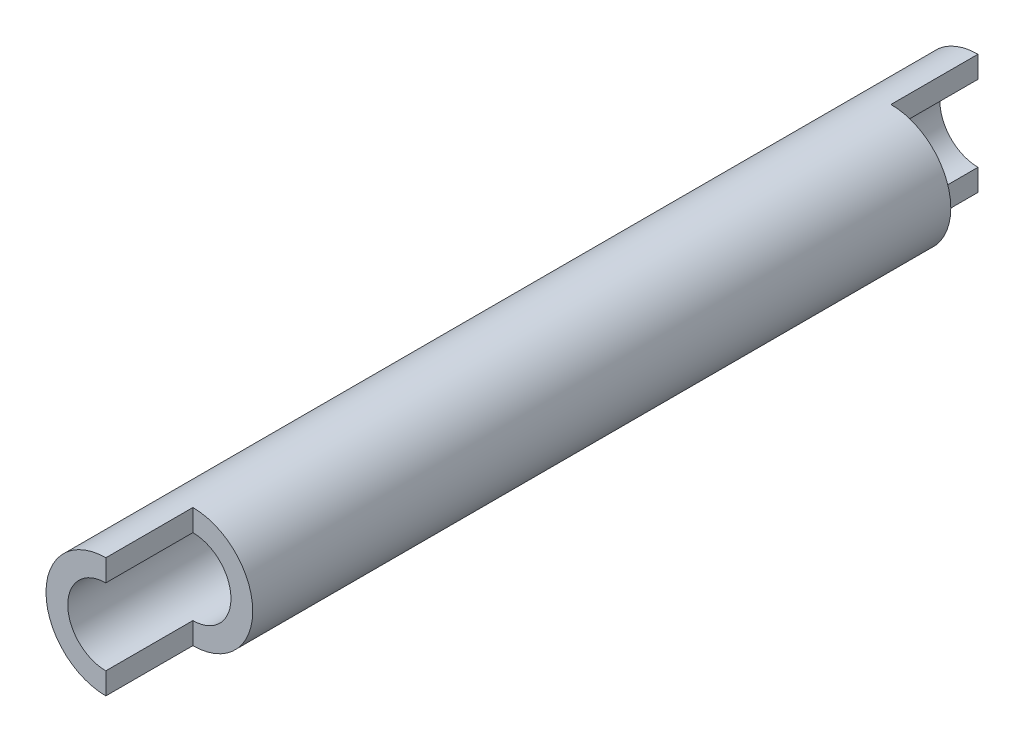
ISO-10303-21;
HEADER;
FILE_DESCRIPTION(('STEP AP214'),'2;1');
FILE_NAME('part.step','',(''),(''),'','','');
FILE_SCHEMA(('AUTOMOTIVE_DESIGN { 1 0 10303 214 1 1 1 1 }'));
ENDSEC;
DATA;
#1=APPLICATION_CONTEXT('core data for automotive mechanical design processes');
#2=APPLICATION_PROTOCOL_DEFINITION('international standard','automotive_design',2000,#1);
#3=PRODUCT_CONTEXT('',#1,'mechanical');
#4=PRODUCT('Part','Part','',(#3));
#5=PRODUCT_RELATED_PRODUCT_CATEGORY('part','',(#4));
#6=PRODUCT_DEFINITION_FORMATION('','',#4);
#7=PRODUCT_DEFINITION_CONTEXT('part definition',#1,'design');
#8=PRODUCT_DEFINITION('design','',#6,#7);
#9=PRODUCT_DEFINITION_SHAPE('','',#8);
#10=(LENGTH_UNIT() NAMED_UNIT(*) SI_UNIT(.MILLI.,.METRE.));
#11=(NAMED_UNIT(*) PLANE_ANGLE_UNIT() SI_UNIT($,.RADIAN.));
#12=(NAMED_UNIT(*) SI_UNIT($,.STERADIAN.) SOLID_ANGLE_UNIT());
#13=UNCERTAINTY_MEASURE_WITH_UNIT(LENGTH_MEASURE(1.E-05),#10,'distance_accuracy_value','');
#14=(GEOMETRIC_REPRESENTATION_CONTEXT(3) GLOBAL_UNCERTAINTY_ASSIGNED_CONTEXT((#13)) GLOBAL_UNIT_ASSIGNED_CONTEXT((#10,
#11,#12)) REPRESENTATION_CONTEXT('',''));
#15=CARTESIAN_POINT('',(0.,0.,0.));
#16=DIRECTION('',(0.,0.,1.));
#17=DIRECTION('',(1.,0.,0.));
#18=AXIS2_PLACEMENT_3D('',#15,#16,#17);
#19=CARTESIAN_POINT('',(0.,0.,64.16));
#20=DIRECTION('',(0.,0.,1.));
#21=DIRECTION('',(1.,0.,0.));
#22=AXIS2_PLACEMENT_3D('',#19,#20,#21);
#23=PLANE('',#22);
#24=DIRECTION('',(0.,1.,0.));
#25=VECTOR('',#24,1.);
#26=CARTESIAN_POINT('',(0.,0.,64.16));
#27=LINE('',#26,#25);
#28=CARTESIAN_POINT('',(0.,-5.5,64.16));
#29=VERTEX_POINT('',#28);
#30=CARTESIAN_POINT('',(0.,-3.5,64.16));
#31=VERTEX_POINT('',#30);
#32=EDGE_CURVE('E157',#29,#31,#27,.T.);
#33=ORIENTED_EDGE('',*,*,#32,.F.);
#34=CARTESIAN_POINT('',(0.,0.,64.16));
#35=DIRECTION('',(0.,0.,1.));
#36=DIRECTION('',(1.,0.,0.));
#37=AXIS2_PLACEMENT_3D('',#34,#35,#36);
#38=CIRCLE('',#37,5.5);
#39=CARTESIAN_POINT('',(0.,5.5,64.16));
#40=VERTEX_POINT('',#39);
#41=EDGE_CURVE('E12',#29,#40,#38,.T.);
#42=ORIENTED_EDGE('',*,*,#41,.T.);
#43=DIRECTION('',(0.,1.,0.));
#44=VECTOR('',#43,1.);
#45=CARTESIAN_POINT('',(0.,0.,64.16));
#46=LINE('',#45,#44);
#47=CARTESIAN_POINT('',(0.,3.5,64.16));
#48=VERTEX_POINT('',#47);
#49=EDGE_CURVE('E153',#48,#40,#46,.T.);
#50=ORIENTED_EDGE('',*,*,#49,.F.);
#51=CARTESIAN_POINT('',(0.,0.,64.16));
#52=DIRECTION('',(0.,0.,1.));
#53=DIRECTION('',(1.,0.,0.));
#54=AXIS2_PLACEMENT_3D('',#51,#52,#53);
#55=CIRCLE('',#54,3.5);
#56=EDGE_CURVE('E160',#31,#48,#55,.T.);
#57=ORIENTED_EDGE('',*,*,#56,.F.);
#58=EDGE_LOOP('',(#33,#42,#50,#57));
#59=FACE_BOUND('',#58,.T.);
#60=ADVANCED_FACE('F39',(#59),#23,.T.);
#61=CARTESIAN_POINT('',(0.,0.,0.));
#62=DIRECTION('',(0.,0.,1.));
#63=DIRECTION('',(1.,0.,0.));
#64=AXIS2_PLACEMENT_3D('',#61,#62,#63);
#65=PLANE('',#64);
#66=CARTESIAN_POINT('',(0.,0.,0.));
#67=DIRECTION('',(0.,0.,1.));
#68=DIRECTION('',(1.,0.,0.));
#69=AXIS2_PLACEMENT_3D('',#66,#67,#68);
#70=CIRCLE('',#69,5.5);
#71=CARTESIAN_POINT('',(0.,-5.5,0.));
#72=VERTEX_POINT('',#71);
#73=CARTESIAN_POINT('',(0.,5.5,0.));
#74=VERTEX_POINT('',#73);
#75=EDGE_CURVE('E43',#72,#74,#70,.T.);
#76=ORIENTED_EDGE('',*,*,#75,.F.);
#77=DIRECTION('',(0.,1.,0.));
#78=VECTOR('',#77,1.);
#79=CARTESIAN_POINT('',(0.,0.,0.));
#80=LINE('',#79,#78);
#81=CARTESIAN_POINT('',(0.,-3.5,0.));
#82=VERTEX_POINT('',#81);
#83=EDGE_CURVE('E155',#72,#82,#80,.T.);
#84=ORIENTED_EDGE('',*,*,#83,.T.);
#85=CARTESIAN_POINT('',(0.,0.,0.));
#86=DIRECTION('',(0.,0.,1.));
#87=DIRECTION('',(1.,0.,0.));
#88=AXIS2_PLACEMENT_3D('',#85,#86,#87);
#89=CIRCLE('',#88,3.5);
#90=CARTESIAN_POINT('',(0.,3.5,0.));
#91=VERTEX_POINT('',#90);
#92=EDGE_CURVE('E109',#82,#91,#89,.T.);
#93=ORIENTED_EDGE('',*,*,#92,.T.);
#94=DIRECTION('',(0.,1.,0.));
#95=VECTOR('',#94,1.);
#96=CARTESIAN_POINT('',(0.,0.,0.));
#97=LINE('',#96,#95);
#98=EDGE_CURVE('E58',#91,#74,#97,.T.);
#99=ORIENTED_EDGE('',*,*,#98,.T.);
#100=EDGE_LOOP('',(#76,#84,#93,#99));
#101=FACE_BOUND('',#100,.T.);
#102=ADVANCED_FACE('F163',(#101),#65,.F.);
#103=CARTESIAN_POINT('',(0.,0.,64.16));
#104=DIRECTION('',(0.,0.,-1.));
#105=DIRECTION('',(-1.,0.,0.));
#106=AXIS2_PLACEMENT_3D('',#103,#104,#105);
#107=CYLINDRICAL_SURFACE('',#106,5.5);
#108=ORIENTED_EDGE('',*,*,#75,.T.);
#109=DIRECTION('',(0.,0.,-1.));
#110=VECTOR('',#109,1.);
#111=CARTESIAN_POINT('',(0.,5.5,92.4583738762489));
#112=LINE('',#111,#110);
#113=CARTESIAN_POINT('',(0.,5.5,-8.));
#114=VERTEX_POINT('',#113);
#115=EDGE_CURVE('E146',#74,#114,#112,.T.);
#116=ORIENTED_EDGE('',*,*,#115,.T.);
#117=CARTESIAN_POINT('',(0.,0.,-8.));
#118=DIRECTION('',(0.,0.,-1.));
#119=DIRECTION('',(-1.,0.,0.));
#120=AXIS2_PLACEMENT_3D('',#117,#118,#119);
#121=CIRCLE('',#120,5.5);
#122=CARTESIAN_POINT('',(0.,-5.5,-8.));
#123=VERTEX_POINT('',#122);
#124=EDGE_CURVE('E122',#123,#114,#121,.T.);
#125=ORIENTED_EDGE('',*,*,#124,.F.);
#126=DIRECTION('',(0.,0.,-1.));
#127=VECTOR('',#126,1.);
#128=CARTESIAN_POINT('',(0.,-5.5,92.4583738762489));
#129=LINE('',#128,#127);
#130=EDGE_CURVE('E118',#72,#123,#129,.T.);
#131=ORIENTED_EDGE('',*,*,#130,.F.);
#132=EDGE_LOOP('',(#108,#116,#125,#131));
#133=FACE_BOUND('',#132,.T.);
#134=ORIENTED_EDGE('',*,*,#41,.F.);
#135=CARTESIAN_POINT('',(0.,-5.5,72.16));
#136=VERTEX_POINT('',#135);
#137=EDGE_CURVE('E147',#136,#29,#129,.T.);
#138=ORIENTED_EDGE('',*,*,#137,.F.);
#139=CARTESIAN_POINT('',(0.,0.,72.16));
#140=DIRECTION('',(0.,0.,1.));
#141=DIRECTION('',(1.,0.,0.));
#142=AXIS2_PLACEMENT_3D('',#139,#140,#141);
#143=CIRCLE('',#142,5.5);
#144=CARTESIAN_POINT('',(0.,5.5,72.16));
#145=VERTEX_POINT('',#144);
#146=EDGE_CURVE('E143',#136,#145,#143,.F.);
#147=ORIENTED_EDGE('',*,*,#146,.T.);
#148=EDGE_CURVE('E142',#145,#40,#112,.T.);
#149=ORIENTED_EDGE('',*,*,#148,.T.);
#150=EDGE_LOOP('',(#134,#138,#147,#149));
#151=FACE_BOUND('',#150,.T.);
#152=ADVANCED_FACE('F41',(#133,#151),#107,.T.);
#153=CARTESIAN_POINT('',(0.,0.,64.16));
#154=DIRECTION('',(0.,0.,-1.));
#155=DIRECTION('',(-1.,0.,0.));
#156=AXIS2_PLACEMENT_3D('',#153,#154,#155);
#157=CYLINDRICAL_SURFACE('',#156,3.5);
#158=ORIENTED_EDGE('',*,*,#92,.F.);
#159=DIRECTION('',(0.,0.,-1.));
#160=VECTOR('',#159,1.);
#161=CARTESIAN_POINT('',(0.,-3.5,92.4583738762489));
#162=LINE('',#161,#160);
#163=CARTESIAN_POINT('',(0.,-3.5,-8.));
#164=VERTEX_POINT('',#163);
#165=EDGE_CURVE('E102',#82,#164,#162,.T.);
#166=ORIENTED_EDGE('',*,*,#165,.T.);
#167=CARTESIAN_POINT('',(0.,0.,-8.));
#168=DIRECTION('',(0.,0.,1.));
#169=DIRECTION('',(-1.,0.,0.));
#170=AXIS2_PLACEMENT_3D('',#167,#168,#169);
#171=CIRCLE('',#170,3.5);
#172=CARTESIAN_POINT('',(0.,3.5,-8.));
#173=VERTEX_POINT('',#172);
#174=EDGE_CURVE('E108',#173,#164,#171,.T.);
#175=ORIENTED_EDGE('',*,*,#174,.F.);
#176=DIRECTION('',(0.,0.,-1.));
#177=VECTOR('',#176,1.);
#178=CARTESIAN_POINT('',(0.,3.5,92.4583738762489));
#179=LINE('',#178,#177);
#180=EDGE_CURVE('E141',#91,#173,#179,.T.);
#181=ORIENTED_EDGE('',*,*,#180,.F.);
#182=EDGE_LOOP('',(#158,#166,#175,#181));
#183=FACE_BOUND('',#182,.T.);
#184=ORIENTED_EDGE('',*,*,#56,.T.);
#185=CARTESIAN_POINT('',(0.,3.5,72.16));
#186=VERTEX_POINT('',#185);
#187=EDGE_CURVE('E137',#186,#48,#179,.T.);
#188=ORIENTED_EDGE('',*,*,#187,.F.);
#189=CARTESIAN_POINT('',(0.,0.,72.16));
#190=DIRECTION('',(0.,0.,1.));
#191=DIRECTION('',(1.,0.,0.));
#192=AXIS2_PLACEMENT_3D('',#189,#190,#191);
#193=CIRCLE('',#192,3.5);
#194=CARTESIAN_POINT('',(0.,-3.5,72.16));
#195=VERTEX_POINT('',#194);
#196=EDGE_CURVE('E112',#186,#195,#193,.T.);
#197=ORIENTED_EDGE('',*,*,#196,.T.);
#198=EDGE_CURVE('E111',#195,#31,#162,.T.);
#199=ORIENTED_EDGE('',*,*,#198,.T.);
#200=EDGE_LOOP('',(#184,#188,#197,#199));
#201=FACE_BOUND('',#200,.T.);
#202=ADVANCED_FACE('F104',(#183,#201),#157,.F.);
#203=CARTESIAN_POINT('',(0.,0.,-8.));
#204=DIRECTION('',(0.,0.,-1.));
#205=DIRECTION('',(-1.,0.,0.));
#206=AXIS2_PLACEMENT_3D('',#203,#204,#205);
#207=PLANE('',#206);
#208=ORIENTED_EDGE('',*,*,#174,.T.);
#209=DIRECTION('',(0.,-1.,0.));
#210=VECTOR('',#209,1.);
#211=CARTESIAN_POINT('',(0.,-3.5,-8.));
#212=LINE('',#211,#210);
#213=EDGE_CURVE('E115',#164,#123,#212,.T.);
#214=ORIENTED_EDGE('',*,*,#213,.T.);
#215=ORIENTED_EDGE('',*,*,#124,.T.);
#216=DIRECTION('',(0.,-1.,0.));
#217=VECTOR('',#216,1.);
#218=CARTESIAN_POINT('',(0.,5.5,-8.));
#219=LINE('',#218,#217);
#220=EDGE_CURVE('E127',#114,#173,#219,.T.);
#221=ORIENTED_EDGE('',*,*,#220,.T.);
#222=EDGE_LOOP('',(#208,#214,#215,#221));
#223=FACE_BOUND('',#222,.T.);
#224=ADVANCED_FACE('F125',(#223),#207,.T.);
#225=CARTESIAN_POINT('',(0.,5.5,92.4583738762489));
#226=DIRECTION('',(1.,0.,0.));
#227=DIRECTION('',(0.,0.,-1.));
#228=AXIS2_PLACEMENT_3D('',#225,#226,#227);
#229=PLANE('',#228);
#230=ORIENTED_EDGE('',*,*,#98,.F.);
#231=ORIENTED_EDGE('',*,*,#180,.T.);
#232=ORIENTED_EDGE('',*,*,#220,.F.);
#233=ORIENTED_EDGE('',*,*,#115,.F.);
#234=EDGE_LOOP('',(#230,#231,#232,#233));
#235=FACE_BOUND('',#234,.T.);
#236=ADVANCED_FACE('F166',(#235),#229,.T.);
#237=CARTESIAN_POINT('',(0.,-3.5,92.4583738762489));
#238=DIRECTION('',(1.,0.,0.));
#239=DIRECTION('',(0.,0.,-1.));
#240=AXIS2_PLACEMENT_3D('',#237,#238,#239);
#241=PLANE('',#240);
#242=ORIENTED_EDGE('',*,*,#83,.F.);
#243=ORIENTED_EDGE('',*,*,#130,.T.);
#244=ORIENTED_EDGE('',*,*,#213,.F.);
#245=ORIENTED_EDGE('',*,*,#165,.F.);
#246=EDGE_LOOP('',(#242,#243,#244,#245));
#247=FACE_BOUND('',#246,.T.);
#248=ADVANCED_FACE('F116',(#247),#241,.T.);
#249=CARTESIAN_POINT('',(0.,0.,72.16));
#250=DIRECTION('',(0.,0.,1.));
#251=DIRECTION('',(1.,0.,0.));
#252=AXIS2_PLACEMENT_3D('',#249,#250,#251);
#253=PLANE('',#252);
#254=ORIENTED_EDGE('',*,*,#196,.F.);
#255=DIRECTION('',(0.,-1.,0.));
#256=VECTOR('',#255,1.);
#257=CARTESIAN_POINT('',(0.,5.5,72.16));
#258=LINE('',#257,#256);
#259=EDGE_CURVE('E138',#145,#186,#258,.T.);
#260=ORIENTED_EDGE('',*,*,#259,.F.);
#261=ORIENTED_EDGE('',*,*,#146,.F.);
#262=DIRECTION('',(0.,-1.,0.));
#263=VECTOR('',#262,1.);
#264=CARTESIAN_POINT('',(0.,-3.5,72.16));
#265=LINE('',#264,#263);
#266=EDGE_CURVE('E132',#195,#136,#265,.T.);
#267=ORIENTED_EDGE('',*,*,#266,.F.);
#268=EDGE_LOOP('',(#254,#260,#261,#267));
#269=FACE_BOUND('',#268,.T.);
#270=ADVANCED_FACE('F181',(#269),#253,.T.);
#271=ORIENTED_EDGE('',*,*,#137,.T.);
#272=ORIENTED_EDGE('',*,*,#32,.T.);
#273=ORIENTED_EDGE('',*,*,#198,.F.);
#274=ORIENTED_EDGE('',*,*,#266,.T.);
#275=EDGE_LOOP('',(#271,#272,#273,#274));
#276=FACE_BOUND('',#275,.T.);
#277=ADVANCED_FACE('F179',(#276),#241,.T.);
#278=ORIENTED_EDGE('',*,*,#187,.T.);
#279=ORIENTED_EDGE('',*,*,#49,.T.);
#280=ORIENTED_EDGE('',*,*,#148,.F.);
#281=ORIENTED_EDGE('',*,*,#259,.T.);
#282=EDGE_LOOP('',(#278,#279,#280,#281));
#283=FACE_BOUND('',#282,.T.);
#284=ADVANCED_FACE('F184',(#283),#229,.T.);
#285=CLOSED_SHELL('',(#60,#102,#152,#202,#224,#236,#248,#270,#277,#284));
#286=MANIFOLD_SOLID_BREP('B2',#285);
#287=ADVANCED_BREP_SHAPE_REPRESENTATION('',(#18,#286),#14);
#288=SHAPE_DEFINITION_REPRESENTATION(#9,#287);
ENDSEC;
END-ISO-10303-21;
